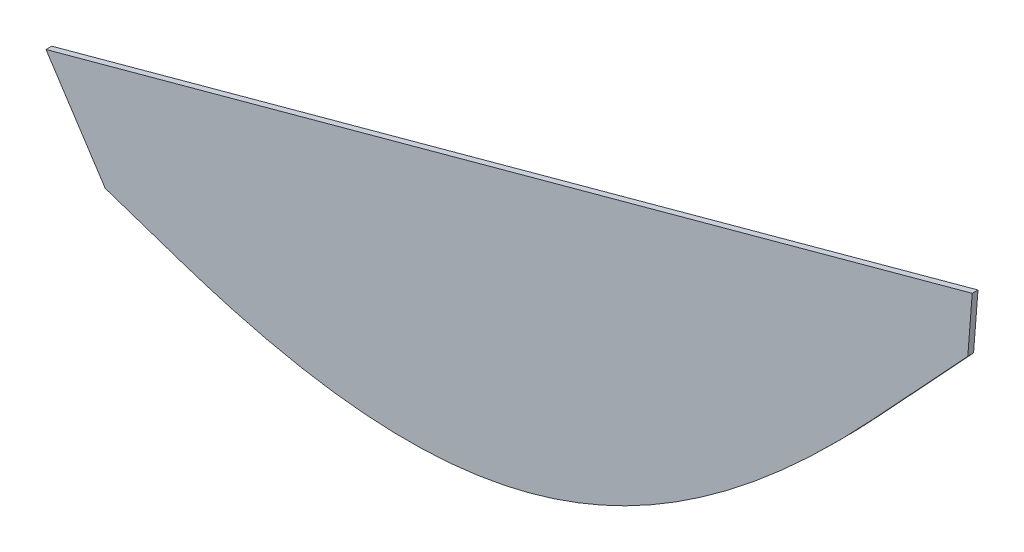
ISO-10303-21;
HEADER;
FILE_DESCRIPTION(('STEP AP214'),'2;1');
FILE_NAME('part.step','',(''),(''),'','','');
FILE_SCHEMA(('AUTOMOTIVE_DESIGN { 1 0 10303 214 1 1 1 1 }'));
ENDSEC;
DATA;
#1=APPLICATION_CONTEXT('core data for automotive mechanical design processes');
#2=APPLICATION_PROTOCOL_DEFINITION('international standard','automotive_design',2000,#1);
#3=PRODUCT_CONTEXT('',#1,'mechanical');
#4=PRODUCT('Part','Part','',(#3));
#5=PRODUCT_RELATED_PRODUCT_CATEGORY('part','',(#4));
#6=PRODUCT_DEFINITION_FORMATION('','',#4);
#7=PRODUCT_DEFINITION_CONTEXT('part definition',#1,'design');
#8=PRODUCT_DEFINITION('design','',#6,#7);
#9=PRODUCT_DEFINITION_SHAPE('','',#8);
#10=(LENGTH_UNIT() NAMED_UNIT(*) SI_UNIT(.MILLI.,.METRE.));
#11=(NAMED_UNIT(*) PLANE_ANGLE_UNIT() SI_UNIT($,.RADIAN.));
#12=(NAMED_UNIT(*) SI_UNIT($,.STERADIAN.) SOLID_ANGLE_UNIT());
#13=UNCERTAINTY_MEASURE_WITH_UNIT(LENGTH_MEASURE(1.E-05),#10,'distance_accuracy_value','');
#14=(GEOMETRIC_REPRESENTATION_CONTEXT(3) GLOBAL_UNCERTAINTY_ASSIGNED_CONTEXT((#13)) GLOBAL_UNIT_ASSIGNED_CONTEXT((#10,
#11,#12)) REPRESENTATION_CONTEXT('',''));
#15=CARTESIAN_POINT('',(0.,0.,0.));
#16=DIRECTION('',(0.,0.,1.));
#17=DIRECTION('',(1.,0.,0.));
#18=AXIS2_PLACEMENT_3D('',#15,#16,#17);
#19=CARTESIAN_POINT('',(-632.852748705174,197.333334962674,5.));
#20=CARTESIAN_POINT('',(-589.920761665967,182.890153448305,5.));
#21=CARTESIAN_POINT('',(-546.988774626759,168.446971933936,5.));
#22=CARTESIAN_POINT('',(-504.056787587552,154.003790419567,5.));
#23=CARTESIAN_POINT('',(-26.4958086255661,-6.65730120492684,5.));
#24=CARTESIAN_POINT('',(300.332199958518,88.4397060242463,5.));
#25=CARTESIAN_POINT('',(700.44072507039,518.714066317965,5.));
#26=CARTESIAN_POINT('',(754.339405201416,576.676390683757,5.));
#27=CARTESIAN_POINT('',(808.238085332441,634.638715049549,5.));
#28=CARTESIAN_POINT('',(862.136765463467,692.601039415341,5.));
#29=B_SPLINE_CURVE_WITH_KNOTS('',3,(#19,#20,#21,#22,#23,#24,#25,#26,#27,#28),.UNSPECIFIED.,.F.,
.F.,(4,3,3,4),(-0.0898984400537148,0.,1.,1.13471015174184),.UNSPECIFIED.);
#30=DIRECTION('',(0.,0.,-1.));
#31=VECTOR('',#30,1.);
#32=SURFACE_OF_LINEAR_EXTRUSION('',#29,#31);
#33=DIRECTION('',(0.,0.,-1.));
#34=VECTOR('',#33,1.);
#35=CARTESIAN_POINT('',(700.44072507039,518.714066317965,5.));
#36=LINE('',#35,#34);
#37=CARTESIAN_POINT('',(700.44072507039,518.714066317965,5.));
#38=VERTEX_POINT('',#37);
#39=CARTESIAN_POINT('',(700.44072507039,518.714066317965,-5.));
#40=VERTEX_POINT('',#39);
#41=EDGE_CURVE('E46',#38,#40,#36,.T.);
#42=ORIENTED_EDGE('',*,*,#41,.T.);
#43=CARTESIAN_POINT('',(862.136765463467,692.601039415341,-5.));
#44=CARTESIAN_POINT('',(857.426398718604,687.535538655698,-5.));
#45=CARTESIAN_POINT('',(852.716031973743,682.470037896053,-5.));
#46=CARTESIAN_POINT('',(843.295298343006,672.339036225118,-5.));
#47=CARTESIAN_POINT('',(838.58493145713,667.273535313828,-5.));
#48=CARTESIAN_POINT('',(829.15664900235,657.134415681816,-5.));
#49=CARTESIAN_POINT('',(824.438733433447,652.060796961093,-5.));
#50=CARTESIAN_POINT('',(815.002902437041,641.91355967169,-5.));
#51=CARTESIAN_POINT('',(810.284987009538,636.83994110301,-5.));
#52=CARTESIAN_POINT('',(800.843356829482,626.686467405593,-5.));
#53=CARTESIAN_POINT('',(796.119642076928,621.606612276856,-5.));
#54=CARTESIAN_POINT('',(786.672212146943,611.446901562185,-5.));
#55=CARTESIAN_POINT('',(781.948496969512,606.36704597625,-5.));
#56=CARTESIAN_POINT('',(772.497015795551,596.202978578363,-5.));
#57=CARTESIAN_POINT('',(767.769249799021,591.118766766411,-5.));
#58=CARTESIAN_POINT('',(758.313719368469,580.950344818812,-5.));
#59=CARTESIAN_POINT('',(753.585954934448,575.866134683164,-5.));
#60=CARTESIAN_POINT('',(744.128127154398,565.695242190346,-5.));
#61=CARTESIAN_POINT('',(739.398063808368,560.608559833179,-5.));
#62=CARTESIAN_POINT('',(732.302965591876,552.978532817018,-5.));
#63=CARTESIAN_POINT('',(729.937930710983,550.435188167753,-5.));
#64=CARTESIAN_POINT('',(725.207861526796,545.348499566679,-5.));
#65=CARTESIAN_POINT('',(722.842827223502,542.80515561487,-5.));
#66=CARTESIAN_POINT('',(718.900918098307,538.566049529912,-5.));
#67=CARTESIAN_POINT('',(717.324043236122,536.870287434335,-5.));
#68=CARTESIAN_POINT('',(714.170292783077,533.478763056066,-5.));
#69=CARTESIAN_POINT('',(712.593417192217,531.783000773375,-5.));
#70=CARTESIAN_POINT('',(710.228103829208,529.239355681993,-5.));
#71=CARTESIAN_POINT('',(709.439665635653,528.391473266315,-5.));
#72=CARTESIAN_POINT('',(707.862787739608,526.695709898773,-5.));
#73=CARTESIAN_POINT('',(707.074348037118,525.847828946908,-5.));
#74=CARTESIAN_POINT('',(705.497476181947,524.152063380283,-5.));
#75=CARTESIAN_POINT('',(704.709044029254,523.304178765533,-5.));
#76=CARTESIAN_POINT('',(703.132157686255,521.608429877959,-5.));
#77=CARTESIAN_POINT('',(702.343703495947,520.760565605136,-5.));
#78=CARTESIAN_POINT('',(700.766877649041,519.064761433475,-5.));
#79=CARTESIAN_POINT('',(699.978505992374,518.216821534702,-5.));
#80=CARTESIAN_POINT('',(698.795094079543,516.945707169144,-5.));
#81=CARTESIAN_POINT('',(698.40048109599,516.522135023935,-5.));
#82=CARTESIAN_POINT('',(697.611014712404,515.675214835433,-5.));
#83=CARTESIAN_POINT('',(697.216161312356,515.251866792154,-5.));
#84=CARTESIAN_POINT('',(696.031223697499,513.9821768286,-5.));
#85=CARTESIAN_POINT('',(695.240761059643,513.136187991569,-5.));
#86=CARTESIAN_POINT('',(693.658829050204,511.445151608996,-5.));
#87=CARTESIAN_POINT('',(692.867359678239,510.60010406381,-5.));
#88=CARTESIAN_POINT('',(690.856411663813,508.455609590131,-5.));
#89=CARTESIAN_POINT('',(689.636238294502,507.156813954692,-5.));
#90=CARTESIAN_POINT('',(687.193466273213,504.561505979332,-5.));
#91=CARTESIAN_POINT('',(685.970867621345,503.264993639309,-5.));
#92=CARTESIAN_POINT('',(682.299393058162,499.378920507581,-5.));
#93=CARTESIAN_POINT('',(679.846843267331,496.792828646688,-5.));
#94=CARTESIAN_POINT('',(674.931761124334,491.630140219602,-5.));
#95=CARTESIAN_POINT('',(672.469228753463,489.053543671218,-5.));
#96=CARTESIAN_POINT('',(667.534000273385,483.910107133305,-5.));
#97=CARTESIAN_POINT('',(665.061304174306,481.343267134059,-5.));
#98=CARTESIAN_POINT('',(660.106912098488,476.221005951823,-5.));
#99=CARTESIAN_POINT('',(657.625221791866,473.665579285372,-5.));
#100=CARTESIAN_POINT('',(652.651303885041,468.565002919863,-5.));
#101=CARTESIAN_POINT('',(650.159076281019,466.019853224532,-5.));
#102=CARTESIAN_POINT('',(642.666293150177,458.400233450837,-5.));
#103=CARTESIAN_POINT('',(637.649627701826,453.341582752947,-5.));
#104=CARTESIAN_POINT('',(627.574449283943,443.271509419351,-5.));
#105=CARTESIAN_POINT('',(622.515959980655,438.260063104647,-5.));
#106=CARTESIAN_POINT('',(612.352854593321,428.284148968115,-5.));
#107=CARTESIAN_POINT('',(607.248238522558,423.31968113276,-5.));
#108=CARTESIAN_POINT('',(596.993430990748,413.442513354977,-5.));
#109=CARTESIAN_POINT('',(591.843260314226,408.529791839265,-5.));
#110=CARTESIAN_POINT('',(581.493442308908,398.756731621593,-5.));
#111=CARTESIAN_POINT('',(576.293794992603,393.896392906409,-5.));
#112=CARTESIAN_POINT('',(565.844509400946,384.232218906712,-5.));
#113=CARTESIAN_POINT('',(560.59488319172,379.428370580151,-5.));
#114=CARTESIAN_POINT('',(550.042678594565,369.879193419164,-5.));
#115=CARTESIAN_POINT('',(544.740100323042,365.133864456146,-5.));
#116=CARTESIAN_POINT('',(534.079697051109,355.704639265964,-5.));
#117=CARTESIAN_POINT('',(528.721866962153,351.020748789024,-5.));
#118=CARTESIAN_POINT('',(517.949704628496,341.718470207092,-5.));
#119=CARTESIAN_POINT('',(512.535372741712,337.100081687607,-5.));
#120=CARTESIAN_POINT('',(499.720894721752,326.309487933606,-5.));
#121=CARTESIAN_POINT('',(492.296416706238,320.166123253464,-5.));
#122=CARTESIAN_POINT('',(477.334061576143,308.014729223511,-5.));
#123=CARTESIAN_POINT('',(469.796153632057,302.006737817254,-5.));
#124=CARTESIAN_POINT('',(454.603552573775,290.137808550979,-5.));
#125=CARTESIAN_POINT('',(446.948842442108,284.276892454465,-5.));
#126=CARTESIAN_POINT('',(431.519034689956,272.714191737247,-5.));
#127=CARTESIAN_POINT('',(423.743926759288,267.012420863318,-5.));
#128=CARTESIAN_POINT('',(408.069465901371,255.780412902185,-5.));
#129=CARTESIAN_POINT('',(400.170100329019,250.25019344538,-5.));
#130=CARTESIAN_POINT('',(384.243026431218,239.37401105711,-5.));
#131=CARTESIAN_POINT('',(376.215292109901,234.028086156847,-5.));
#132=CARTESIAN_POINT('',(360.090244509877,223.574420877477,-5.));
#133=CARTESIAN_POINT('',(351.993884111275,218.465212030046,-5.));
#134=CARTESIAN_POINT('',(335.671297707602,208.457192839271,-5.));
#135=CARTESIAN_POINT('',(327.445063325068,203.558396144928,-5.));
#136=CARTESIAN_POINT('',(310.863342774435,193.986889476383,-5.));
#137=CARTESIAN_POINT('',(302.507872966068,189.314151189927,-5.));
#138=CARTESIAN_POINT('',(285.66850527385,180.210052138818,-5.));
#139=CARTESIAN_POINT('',(277.184633906016,175.778642383977,-5.));
#140=CARTESIAN_POINT('',(260.089607089175,167.171980896972,-5.));
#141=CARTESIAN_POINT('',(251.478473233369,162.996686313993,-5.));
#142=CARTESIAN_POINT('',(234.130309460935,154.916336426924,-5.));
#143=CARTESIAN_POINT('',(225.393281864644,151.011276149845,-5.));
#144=CARTESIAN_POINT('',(209.435304564642,144.186107203842,-5.));
#145=CARTESIAN_POINT('',(202.234869103938,141.217961366601,-5.));
#146=CARTESIAN_POINT('',(187.75562800776,135.477026850775,-5.));
#147=CARTESIAN_POINT('',(180.476814824824,132.704257183629,-5.));
#148=CARTESIAN_POINT('',(165.845231847423,127.361126653689,-5.));
#149=CARTESIAN_POINT('',(158.492461978002,124.790765996064,-5.));
#150=CARTESIAN_POINT('',(143.71761879287,119.858578997639,-5.));
#151=CARTESIAN_POINT('',(136.295548459969,117.496743726888,-5.));
#152=CARTESIAN_POINT('',(121.387094389791,112.98679019179,-5.));
#153=CARTESIAN_POINT('',(113.900713571175,110.83866228366,-5.));
#154=CARTESIAN_POINT('',(98.8689605812619,106.760298329486,-5.));
#155=CARTESIAN_POINT('',(91.3235894933869,104.830058291696,-5.));
#156=CARTESIAN_POINT('',(76.1842163349745,101.191721277041,-5.));
#157=CARTESIAN_POINT('',(68.5902458728286,99.4834928018957,-5.));
#158=CARTESIAN_POINT('',(53.355081310674,96.2898153207027,-5.));
#159=CARTESIAN_POINT('',(45.7138841467098,94.8043809303795,-5.));
#160=CARTESIAN_POINT('',(30.3910201523283,92.0572822224129,-5.));
#161=CARTESIAN_POINT('',(22.7093514870976,90.7956281415296,-5.));
#162=CARTESIAN_POINT('',(7.31246992441731,88.4958852902459,-5.));
#163=CARTESIAN_POINT('',(-0.402743673955705,87.4578012144807,-5.));
#164=CARTESIAN_POINT('',(-15.859589450617,85.6038245821358,-5.));
#165=CARTESIAN_POINT('',(-23.6012209870885,84.7879266659703,-5.));
#166=CARTESIAN_POINT('',(-39.1037064059664,83.3758187568032,-5.));
#167=CARTESIAN_POINT('',(-46.8645582005944,82.7795858732344,-5.));
#168=CARTESIAN_POINT('',(-60.3001274518359,81.935067875217,-5.));
#169=CARTESIAN_POINT('',(-65.9717339861006,81.6362948763286,-5.));
#170=CARTESIAN_POINT('',(-77.3198839818543,81.1520175008019,-5.));
#171=CARTESIAN_POINT('',(-82.996427512687,80.9665147417225,-5.));
#172=CARTESIAN_POINT('',(-94.352535955166,80.7068306307365,-5.));
#173=CARTESIAN_POINT('',(-100.03210108834,80.6326590548165,-5.));
#174=CARTESIAN_POINT('',(-111.391713173472,80.5934993046555,-5.));
#175=CARTESIAN_POINT('',(-117.071760132981,80.6285133949545,-5.));
#176=CARTESIAN_POINT('',(-128.431508682422,80.8053954007922,-5.));
#177=CARTESIAN_POINT('',(-134.111209878478,80.9472883907712,-5.));
#178=CARTESIAN_POINT('',(-145.467137364485,81.3354405749481,-5.));
#179=CARTESIAN_POINT('',(-151.143363583993,81.581701818969,-5.));
#180=CARTESIAN_POINT('',(-162.491634357959,82.1759985494313,-5.));
#181=CARTESIAN_POINT('',(-168.16367783614,82.5240545837123,-5.));
#182=CARTESIAN_POINT('',(-179.500854420752,83.3191524835116,-5.));
#183=CARTESIAN_POINT('',(-185.165987401283,83.7661961261552,-5.));
#184=CARTESIAN_POINT('',(-202.148431356925,85.2515328659754,-5.));
#185=CARTESIAN_POINT('',(-213.453411098263,86.4340650407862,-5.));
#186=CARTESIAN_POINT('',(-236.09420664203,89.1693102565935,-5.));
#187=CARTESIAN_POINT('',(-247.429728264635,90.7244306440174,-5.));
#188=CARTESIAN_POINT('',(-270.046034742762,94.1760217292224,-5.));
#189=CARTESIAN_POINT('',(-281.326830794313,96.0724192966623,-5.));
#190=CARTESIAN_POINT('',(-303.829065516744,100.182632818398,-5.));
#191=CARTESIAN_POINT('',(-315.050509955203,102.396417319887,-5.));
#192=CARTESIAN_POINT('',(-337.429413602364,107.117938639319,-5.));
#193=CARTESIAN_POINT('',(-348.586882169665,109.625631249977,-5.));
#194=CARTESIAN_POINT('',(-370.833195434612,114.912088094366,-5.));
#195=CARTESIAN_POINT('',(-381.922062805006,117.690757050793,-5.));
#196=CARTESIAN_POINT('',(-399.793237280761,122.38501094228,-5.));
#197=CARTESIAN_POINT('',(-406.59610274597,124.222880364769,-5.));
#198=CARTESIAN_POINT('',(-420.175730334186,127.989004427823,-5.));
#199=CARTESIAN_POINT('',(-426.952496159542,129.917245696159,-5.));
#200=CARTESIAN_POINT('',(-437.098697369494,132.874179487298,-5.));
#201=CARTESIAN_POINT('',(-440.477586493448,133.870579952229,-5.));
#202=CARTESIAN_POINT('',(-447.229104822326,135.88437638697,-5.));
#203=CARTESIAN_POINT('',(-450.601734032617,136.901772338772,-5.));
#204=CARTESIAN_POINT('',(-457.341050564397,138.957119919101,-5.));
#205=CARTESIAN_POINT('',(-460.707737330267,139.99507336926,-5.));
#206=CARTESIAN_POINT('',(-465.753104186855,141.566965957433,-5.));
#207=CARTESIAN_POINT('',(-467.434118356378,142.09342466275,-5.));
#208=CARTESIAN_POINT('',(-470.794596834014,143.151266320416,-5.));
#209=CARTESIAN_POINT('',(-472.474061142387,143.682649271938,-5.));
#210=CARTESIAN_POINT('',(-475.831740313165,144.750370753085,-5.));
#211=CARTESIAN_POINT('',(-477.509954902372,145.286710141729,-5.));
#212=CARTESIAN_POINT('',(-480.864842932269,146.364190090681,-5.));
#213=CARTESIAN_POINT('',(-482.541516372193,146.905330653377,-5.));
#214=CARTESIAN_POINT('',(-485.893319374096,147.992349141118,-5.));
#215=CARTESIAN_POINT('',(-487.568448942478,148.538227046419,-5.));
#216=CARTESIAN_POINT('',(-490.079992829386,149.360552617318,-5.));
#217=CARTESIAN_POINT('',(-490.916982004299,149.635245802021,-5.));
#218=CARTESIAN_POINT('',(-492.590578202289,150.185794451695,-5.));
#219=CARTESIAN_POINT('',(-493.427185225316,150.461649916821,-5.));
#220=CARTESIAN_POINT('',(-495.100184305143,151.014570734049,-5.));
#221=CARTESIAN_POINT('',(-495.936576285857,151.291636316353,-5.));
#222=CARTESIAN_POINT('',(-497.608978974601,151.846915116462,-5.));
#223=CARTESIAN_POINT('',(-498.44498968274,152.125128333941,-5.));
#224=CARTESIAN_POINT('',(-499.698720756968,152.543303917598,-5.));
#225=CARTESIAN_POINT('',(-500.116583861105,152.682838486831,-5.));
#226=CARTESIAN_POINT('',(-500.952215217882,152.962191271161,-5.));
#227=CARTESIAN_POINT('',(-501.36998347053,153.102009486236,-5.));
#228=CARTESIAN_POINT('',(-502.205424490126,153.381931290465,-5.));
#229=CARTESIAN_POINT('',(-502.623097257046,153.522034879702,-5.));
#230=CARTESIAN_POINT('',(-503.249537237981,153.732396279836,-5.));
#231=CARTESIAN_POINT('',(-503.458339045274,153.802551085473,-5.));
#232=CARTESIAN_POINT('',(-503.875915438301,153.942941672389,-5.));
#233=CARTESIAN_POINT('',(-504.084690024033,154.01317745367,-5.));
#234=CARTESIAN_POINT('',(-504.711014933295,154.223885430643,-5.));
#235=CARTESIAN_POINT('',(-505.12856517969,154.364357845942,-5.));
#236=CARTESIAN_POINT('',(-505.963665711264,154.645302518036,-5.));
#237=CARTESIAN_POINT('',(-506.381215996443,154.785774774831,-5.));
#238=CARTESIAN_POINT('',(-507.633866747017,155.207191556991,-5.));
#239=CARTESIAN_POINT('',(-508.468967197623,155.488136124468,-5.));
#240=CARTESIAN_POINT('',(-510.139167761015,156.05002511218,-5.));
#241=CARTESIAN_POINT('',(-510.974267873802,156.330969532416,-5.));
#242=CARTESIAN_POINT('',(-512.644468124769,156.892858390234,-5.));
#243=CARTESIAN_POINT('',(-513.47956826295,157.173802827817,-5.));
#244=CARTESIAN_POINT('',(-515.961689604776,158.008838233144,-5.));
#245=CARTESIAN_POINT('',(-517.60871080916,158.562929198788,-5.));
#246=CARTESIAN_POINT('',(-520.902753420823,159.671111200028,-5.));
#247=CARTESIAN_POINT('',(-522.549774828102,160.225202235624,-5.));
#248=CARTESIAN_POINT('',(-525.843814569118,161.333383272362,-5.));
#249=CARTESIAN_POINT('',(-527.490832902854,161.887473273502,-5.));
#250=CARTESIAN_POINT('',(-530.784869515781,162.995653257555,-5.));
#251=CARTESIAN_POINT('',(-532.431887794971,163.549743240467,-5.));
#252=CARTESIAN_POINT('',(-535.72587838214,164.657907740621,-5.));
#253=CARTESIAN_POINT('',(-537.372850690118,165.211982257862,-5.));
#254=CARTESIAN_POINT('',(-540.666795320678,166.320131297267,-5.));
#255=CARTESIAN_POINT('',(-542.313767643259,166.87420581943,-5.));
#256=CARTESIAN_POINT('',(-547.254686203734,168.536429921743,-5.));
#257=CARTESIAN_POINT('',(-550.548632441629,169.644579501892,-5.));
#258=CARTESIAN_POINT('',(-557.136106237074,171.860737809725,-5.));
#259=CARTESIAN_POINT('',(-560.429633794624,172.968746537409,-5.));
#260=CARTESIAN_POINT('',(-567.016688478577,175.184763847731,-5.));
#261=CARTESIAN_POINT('',(-570.310215604979,176.292772430369,-5.));
#262=CARTESIAN_POINT('',(-576.896528007989,178.508540022494,-5.));
#263=CARTESIAN_POINT('',(-580.189313284596,179.616299031982,-5.));
#264=CARTESIAN_POINT('',(-586.774883955356,181.831817090501,-5.));
#265=CARTESIAN_POINT('',(-590.067669349508,182.939576139533,-5.));
#266=CARTESIAN_POINT('',(-599.943893572535,186.262136052716,-5.));
#267=CARTESIAN_POINT('',(-606.527332401409,188.476936916868,-5.));
#268=CARTESIAN_POINT('',(-619.691430388581,192.905603508238,-5.));
#269=CARTESIAN_POINT('',(-626.272089546878,195.119469235456,-5.));
#270=CARTESIAN_POINT('',(-632.852748705174,197.333334962674,-5.));
#271=B_SPLINE_CURVE_WITH_KNOTS('',3,(#43,#44,#45,#46,#47,#48,#49,#50,#51,#52,#53,#54,#55,#56,
#57,#58,#59,#60,#61,#62,#63,#64,#65,#66,#67,#68,#69,#70,#71,#72,#73,#74,#75,#76,#77,#78,#79,#80,
#81,#82,#83,#84,#85,#86,#87,#88,#89,#90,#91,#92,#93,#94,#95,#96,#97,#98,#99,#100,#101,#102,#103,
#104,#105,#106,#107,#108,#109,#110,#111,#112,#113,#114,#115,#116,#117,#118,#119,#120,#121,#122,
#123,#124,#125,#126,#127,#128,#129,#130,#131,#132,#133,#134,#135,#136,#137,#138,#139,#140,#141,
#142,#143,#144,#145,#146,#147,#148,#149,#150,#151,#152,#153,#154,#155,#156,#157,#158,#159,#160,
#161,#162,#163,#164,#165,#166,#167,#168,#169,#170,#171,#172,#173,#174,#175,#176,#177,#178,#179,
#180,#181,#182,#183,#184,#185,#186,#187,#188,#189,#190,#191,#192,#193,#194,#195,#196,#197,#198,
#199,#200,#201,#202,#203,#204,#205,#206,#207,#208,#209,#210,#211,#212,#213,#214,#215,#216,#217,
#218,#219,#220,#221,#222,#223,#224,#225,#226,#227,#228,#229,#230,#231,#232,#233,#234,#235,#236,
#237,#238,#239,#240,#241,#242,#243,#244,#245,#246,#247,#248,#249,#250,#251,#252,#253,#254,#255,
#256,#257,#258,#259,#260,#261,#262,#263,#264,#265,#266,#267,#268,#269,#270),.UNSPECIFIED.,.F.,
.F.,(4,2,2,2,2,2,2,2,2,2,2,2,2,2,2,2,2,2,2,2,2,2,2,2,2,2,2,2,2,2,2,2,2,2,2,2,2,2,2,2,2,2,2,2,2,
2,2,2,2,2,2,2,2,2,2,2,2,2,2,2,2,2,2,2,2,2,2,2,2,2,2,2,2,2,2,2,2,2,2,2,2,2,2,2,2,2,2,2,2,2,2,2,2,
2,2,2,2,2,2,2,2,2,2,2,2,2,2,2,2,2,2,2,2,4),(0.,20.7514258631425,41.5028523475205,
62.2875344029935,83.072215835571,103.882446077739,124.692678192325,145.520756106543,
166.348827145956,187.187025963106,197.606139549881,208.025250424638,214.972141149062,
221.919033774962,225.392483698336,228.865933497668,232.339375885295,235.812818735735,
239.286258630584,241.022978061913,242.759697595846,246.233132224416,249.706568166356,
255.05270709249,260.398845776533,271.091143881642,281.783462032321,292.475769531119,
303.162221641367,313.848677625589,335.221548150347,356.583055769782,377.944557237627,
399.29676930969,420.648975990908,441.996152239919,463.343281571651,484.69239479479,
506.04137286168,534.949552139937,563.865735711472,592.786173227756,621.709101174355,
650.634991758726,679.566816214463,708.284791425222,737.004626706642,765.720855665262,
794.431233272285,823.136794149037,851.841826631043,875.203777437486,898.567998391316,
921.932243027568,945.295486620903,968.657675443224,992.019436196341,1015.36729600966,
1038.71668681859,1062.06714546277,1085.41809438379,1108.76847998213,1132.11643162525,
1149.15377528853,1166.19136224839,1183.23044519057,1200.26988153025,1217.31331667096,
1234.35708656524,1251.4042992157,1268.45181793972,1302.54498246986,1336.86466823288,
1371.177008564,1405.4859509154,1439.78973939945,1474.08150960727,1495.22121951047,
1516.35781120815,1526.92598144293,1537.49414261305,1548.06324447125,1553.34781071686,
1558.63237607569,1563.91787517356,1569.20337690012,1574.4888566081,1577.13159408326,
1579.77433190924,1582.41759649954,1585.06086033624,1586.38249379895,1587.70412715709,
1589.02576089277,1589.68657781476,1590.34739475219,1591.6690325177,1592.99067023541,
1595.63394538542,1598.27721943276,1600.92049356923,1606.13367501749,1611.34685710965,
1616.56002947293,1621.77320166367,1626.98622834547,1632.1992550735,1642.62531357089,
1653.05004685365,1663.47477877174,1673.89716257337,1684.31954674705,1705.15756697769,
1725.9867889445),.UNSPECIFIED.);
#272=CARTESIAN_POINT('',(862.136765463467,692.601039415341,-5.));
#273=VERTEX_POINT('',#272);
#274=EDGE_CURVE('E108',#273,#40,#271,.T.);
#275=ORIENTED_EDGE('',*,*,#274,.F.);
#276=DIRECTION('',(0.,0.,-1.));
#277=VECTOR('',#276,1.);
#278=CARTESIAN_POINT('',(862.136765463467,692.601039415341,885.186367491948));
#279=LINE('',#278,#277);
#280=CARTESIAN_POINT('',(862.136765463467,692.601039415341,4.99999999999989));
#281=VERTEX_POINT('',#280);
#282=EDGE_CURVE('E118',#281,#273,#279,.T.);
#283=ORIENTED_EDGE('',*,*,#282,.F.);
#284=CARTESIAN_POINT('',(-632.852748705174,197.333334962674,5.));
#285=CARTESIAN_POINT('',(-589.920761665967,182.890153448305,5.));
#286=CARTESIAN_POINT('',(-546.988774626759,168.446971933936,5.));
#287=CARTESIAN_POINT('',(-504.056787587552,154.003790419567,5.));
#288=CARTESIAN_POINT('',(-26.4958086255661,-6.65730120492684,5.));
#289=CARTESIAN_POINT('',(300.332199958518,88.4397060242463,5.));
#290=CARTESIAN_POINT('',(700.44072507039,518.714066317965,5.));
#291=CARTESIAN_POINT('',(754.339405201416,576.676390683757,5.));
#292=CARTESIAN_POINT('',(808.238085332441,634.638715049549,5.));
#293=CARTESIAN_POINT('',(862.136765463467,692.601039415341,5.));
#294=B_SPLINE_CURVE_WITH_KNOTS('',3,(#284,#285,#286,#287,#288,#289,#290,#291,#292,#293),
.UNSPECIFIED.,.F.,.F.,(4,3,3,4),(-0.0898984400537148,0.,1.,1.13471015174184),.UNSPECIFIED.);
#295=EDGE_CURVE('E156',#281,#38,#294,.F.);
#296=ORIENTED_EDGE('',*,*,#295,.T.);
#297=EDGE_LOOP('',(#42,#275,#283,#296));
#298=FACE_BOUND('',#297,.T.);
#299=ADVANCED_FACE('F34',(#298),#32,.F.);
#300=CARTESIAN_POINT('',(863.247718836085,706.828218232723,1775.3727349839));
#301=DIRECTION('',(0.996965106025504,-0.0778497101314829,0.));
#302=DIRECTION('',(0.0778497101314829,0.996965106025504,0.));
#303=AXIS2_PLACEMENT_3D('',#300,#301,#302);
#304=PLANE('',#303);
#305=DIRECTION('',(0.0778497101314829,0.996965106025504,0.));
#306=VECTOR('',#305,1.);
#307=CARTESIAN_POINT('',(863.247718836085,706.828218232723,4.99999999999989));
#308=LINE('',#307,#306);
#309=CARTESIAN_POINT('',(869.827615137836,791.09220589603,4.99999999999989));
#310=VERTEX_POINT('',#309);
#311=EDGE_CURVE('E204',#281,#310,#308,.T.);
#312=ORIENTED_EDGE('',*,*,#311,.F.);
#313=ORIENTED_EDGE('',*,*,#282,.T.);
#314=DIRECTION('',(-0.0778497101314829,-0.996965106025504,0.));
#315=VECTOR('',#314,1.);
#316=CARTESIAN_POINT('',(863.247718836085,706.828218232723,-5.));
#317=LINE('',#316,#315);
#318=CARTESIAN_POINT('',(869.827615137836,791.09220589603,-5.));
#319=VERTEX_POINT('',#318);
#320=EDGE_CURVE('E112',#319,#273,#317,.T.);
#321=ORIENTED_EDGE('',*,*,#320,.F.);
#322=DIRECTION('',(0.,0.,-1.));
#323=VECTOR('',#322,1.);
#324=CARTESIAN_POINT('',(869.827615137836,791.09220589603,1775.3727349839));
#325=LINE('',#324,#323);
#326=EDGE_CURVE('E96',#310,#319,#325,.T.);
#327=ORIENTED_EDGE('',*,*,#326,.F.);
#328=EDGE_LOOP('',(#312,#313,#321,#327));
#329=FACE_BOUND('',#328,.T.);
#330=ADVANCED_FACE('F139',(#329),#304,.T.);
#331=CARTESIAN_POINT('',(-504.056787587552,154.003790419567,5.));
#332=CARTESIAN_POINT('',(-26.4958086255661,-6.65730120492684,5.));
#333=CARTESIAN_POINT('',(300.332199958518,88.4397060242463,5.));
#334=CARTESIAN_POINT('',(700.44072507039,518.714066317965,5.));
#335=B_SPLINE_CURVE_WITH_KNOTS('',3,(#331,#332,#333,#334),.UNSPECIFIED.,.F.,.F.,(4,4),(0.,1.),.UNSPECIFIED.);
#336=DIRECTION('',(0.,0.,-1.));
#337=VECTOR('',#336,1.);
#338=SURFACE_OF_LINEAR_EXTRUSION('',#335,#337);
#339=CARTESIAN_POINT('',(-504.056787587552,154.003790419567,-5.));
#340=CARTESIAN_POINT('',(-26.4958086255661,-6.65730120492684,-5.));
#341=CARTESIAN_POINT('',(300.332199958518,88.4397060242463,-5.));
#342=CARTESIAN_POINT('',(700.44072507039,518.714066317965,-5.));
#343=B_SPLINE_CURVE_WITH_KNOTS('',3,(#339,#340,#341,#342),.UNSPECIFIED.,.F.,.F.,(4,4),(0.,1.),.UNSPECIFIED.);
#344=CARTESIAN_POINT('',(-504.056787587552,154.003790419567,-5.));
#345=VERTEX_POINT('',#344);
#346=EDGE_CURVE('E162',#345,#40,#343,.T.);
#347=ORIENTED_EDGE('',*,*,#346,.T.);
#348=ORIENTED_EDGE('',*,*,#41,.F.);
#349=CARTESIAN_POINT('',(700.44072507039,518.714066317965,5.));
#350=CARTESIAN_POINT('',(300.332199958518,88.4397060242463,5.));
#351=CARTESIAN_POINT('',(-26.4958086255661,-6.65730120492684,5.));
#352=CARTESIAN_POINT('',(-504.056787587552,154.003790419567,5.));
#353=B_SPLINE_CURVE_WITH_KNOTS('',3,(#349,#350,#351,#352),.UNSPECIFIED.,.F.,.F.,(4,4),(0.,1.),.UNSPECIFIED.);
#354=CARTESIAN_POINT('',(-504.056787587552,154.003790419567,5.));
#355=VERTEX_POINT('',#354);
#356=EDGE_CURVE('E166',#355,#38,#353,.F.);
#357=ORIENTED_EDGE('',*,*,#356,.F.);
#358=DIRECTION('',(0.,0.,-1.));
#359=VECTOR('',#358,1.);
#360=CARTESIAN_POINT('',(-504.056787587552,154.003790419567,5.));
#361=LINE('',#360,#359);
#362=EDGE_CURVE('E160',#355,#345,#361,.T.);
#363=ORIENTED_EDGE('',*,*,#362,.T.);
#364=EDGE_LOOP('',(#347,#348,#357,#363));
#365=FACE_BOUND('',#364,.T.);
#366=ADVANCED_FACE('F36',(#365),#338,.F.);
#367=CARTESIAN_POINT('',(127.236638935212,114.758133899436,5.));
#368=DIRECTION('',(0.,0.,-1.));
#369=DIRECTION('',(-1.,0.,0.));
#370=AXIS2_PLACEMENT_3D('',#367,#368,#369);
#371=PLANE('',#370);
#372=ORIENTED_EDGE('',*,*,#356,.T.);
#373=ORIENTED_EDGE('',*,*,#295,.F.);
#374=ORIENTED_EDGE('',*,*,#311,.T.);
#375=DIRECTION('',(0.964930706143645,0.262504728226231,0.));
#376=VECTOR('',#375,1.);
#377=CARTESIAN_POINT('',(-593.261399645903,393.065920950119,5.));
#378=LINE('',#377,#376);
#379=CARTESIAN_POINT('',(-735.441473342662,354.386520069495,4.99999999999989));
#380=VERTEX_POINT('',#379);
#381=EDGE_CURVE('E167',#380,#310,#378,.T.);
#382=ORIENTED_EDGE('',*,*,#381,.F.);
#383=DIRECTION('',(0.546876265846275,-0.837213443426487,0.));
#384=VECTOR('',#383,1.);
#385=CARTESIAN_POINT('',(-636.936300423007,203.584848529104,4.99999999999989));
#386=LINE('',#385,#384);
#387=CARTESIAN_POINT('',(-632.852748705174,197.333334962674,5.));
#388=VERTEX_POINT('',#387);
#389=EDGE_CURVE('E107',#380,#388,#386,.T.);
#390=ORIENTED_EDGE('',*,*,#389,.T.);
#391=EDGE_CURVE('E54',#355,#388,#294,.F.);
#392=ORIENTED_EDGE('',*,*,#391,.F.);
#393=EDGE_LOOP('',(#372,#373,#374,#382,#390,#392));
#394=FACE_BOUND('',#393,.T.);
#395=ADVANCED_FACE('F189',(#394),#371,.F.);
#396=CARTESIAN_POINT('',(127.236638935212,114.758133899436,-5.));
#397=DIRECTION('',(0.,0.,-1.));
#398=DIRECTION('',(-1.,0.,0.));
#399=AXIS2_PLACEMENT_3D('',#396,#397,#398);
#400=PLANE('',#399);
#401=DIRECTION('',(-0.964930706143645,-0.262504728226231,0.));
#402=VECTOR('',#401,1.);
#403=CARTESIAN_POINT('',(7.0929836983261,556.389425151821,-5.));
#404=LINE('',#403,#402);
#405=CARTESIAN_POINT('',(-735.441473342662,354.386520069495,-5.));
#406=VERTEX_POINT('',#405);
#407=EDGE_CURVE('E11',#319,#406,#404,.T.);
#408=ORIENTED_EDGE('',*,*,#407,.F.);
#409=ORIENTED_EDGE('',*,*,#320,.T.);
#410=ORIENTED_EDGE('',*,*,#274,.T.);
#411=ORIENTED_EDGE('',*,*,#346,.F.);
#412=CARTESIAN_POINT('',(-632.852748705174,197.333334962674,-5.));
#413=VERTEX_POINT('',#412);
#414=EDGE_CURVE('E61',#345,#413,#271,.T.);
#415=ORIENTED_EDGE('',*,*,#414,.T.);
#416=DIRECTION('',(-0.546876265846275,0.837213443426486,0.));
#417=VECTOR('',#416,1.);
#418=CARTESIAN_POINT('',(-636.936300423007,203.584848529104,-5.));
#419=LINE('',#418,#417);
#420=EDGE_CURVE('E106',#413,#406,#419,.T.);
#421=ORIENTED_EDGE('',*,*,#420,.T.);
#422=EDGE_LOOP('',(#408,#409,#410,#411,#415,#421));
#423=FACE_BOUND('',#422,.T.);
#424=ADVANCED_FACE('F110',(#423),#400,.T.);
#425=CARTESIAN_POINT('',(-593.261399645903,393.065920950119,-5.));
#426=DIRECTION('',(0.262504728226231,-0.964930706143645,0.));
#427=DIRECTION('',(0.964930706143645,0.262504728226231,0.));
#428=AXIS2_PLACEMENT_3D('',#425,#426,#427);
#429=PLANE('',#428);
#430=ORIENTED_EDGE('',*,*,#407,.T.);
#431=DIRECTION('',(0.,0.,-1.));
#432=VECTOR('',#431,1.);
#433=CARTESIAN_POINT('',(-735.441473342662,354.386520069495,1775.3727349839));
#434=LINE('',#433,#432);
#435=EDGE_CURVE('E94',#380,#406,#434,.T.);
#436=ORIENTED_EDGE('',*,*,#435,.F.);
#437=ORIENTED_EDGE('',*,*,#381,.T.);
#438=ORIENTED_EDGE('',*,*,#326,.T.);
#439=EDGE_LOOP('',(#430,#436,#437,#438));
#440=FACE_BOUND('',#439,.T.);
#441=ADVANCED_FACE('F93',(#440),#429,.F.);
#442=CARTESIAN_POINT('',(-636.936300423007,203.584848529104,1775.3727349839));
#443=DIRECTION('',(-0.837213443426486,-0.546876265846275,0.));
#444=DIRECTION('',(0.546876265846275,-0.837213443426487,0.));
#445=AXIS2_PLACEMENT_3D('',#442,#443,#444);
#446=PLANE('',#445);
#447=ORIENTED_EDGE('',*,*,#389,.F.);
#448=ORIENTED_EDGE('',*,*,#435,.T.);
#449=ORIENTED_EDGE('',*,*,#420,.F.);
#450=DIRECTION('',(0.,0.,-1.));
#451=VECTOR('',#450,1.);
#452=CARTESIAN_POINT('',(-632.852748705174,197.333334962674,885.186367491948));
#453=LINE('',#452,#451);
#454=EDGE_CURVE('E206',#388,#413,#453,.T.);
#455=ORIENTED_EDGE('',*,*,#454,.F.);
#456=EDGE_LOOP('',(#447,#448,#449,#455));
#457=FACE_BOUND('',#456,.T.);
#458=ADVANCED_FACE('F104',(#457),#446,.T.);
#459=ORIENTED_EDGE('',*,*,#362,.F.);
#460=ORIENTED_EDGE('',*,*,#391,.T.);
#461=ORIENTED_EDGE('',*,*,#454,.T.);
#462=ORIENTED_EDGE('',*,*,#414,.F.);
#463=EDGE_LOOP('',(#459,#460,#461,#462));
#464=FACE_BOUND('',#463,.T.);
#465=ADVANCED_FACE('F143',(#464),#32,.F.);
#466=CLOSED_SHELL('',(#299,#330,#366,#395,#424,#441,#458,#465));
#467=MANIFOLD_SOLID_BREP('B2',#466);
#468=ADVANCED_BREP_SHAPE_REPRESENTATION('',(#18,#467),#14);
#469=SHAPE_DEFINITION_REPRESENTATION(#9,#468);
ENDSEC;
END-ISO-10303-21;
